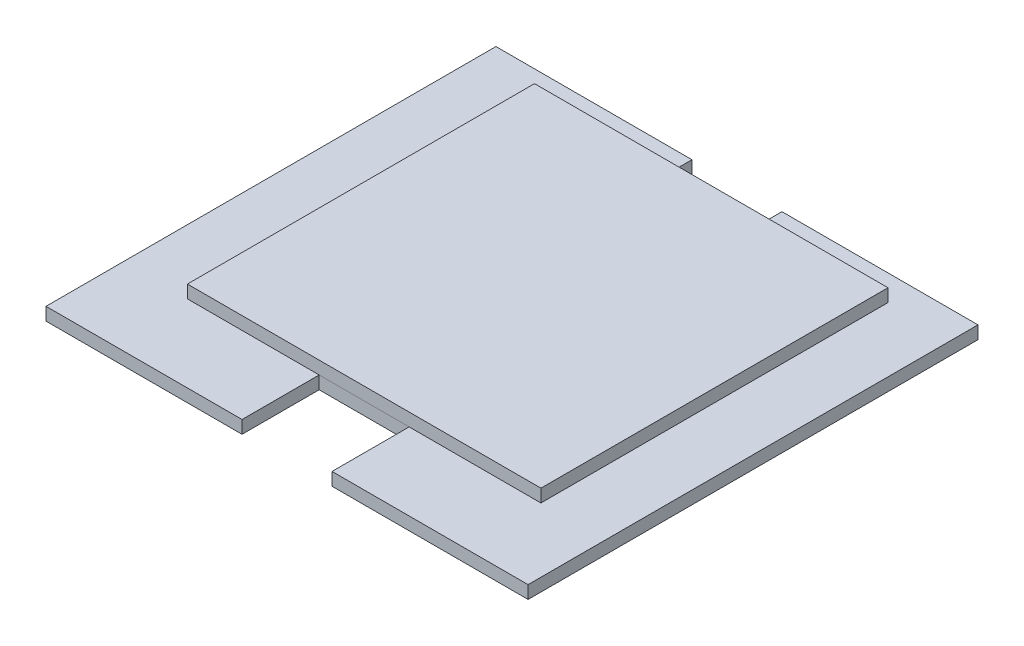
ISO-10303-21;
HEADER;
FILE_DESCRIPTION(('STEP AP214'),'2;1');
FILE_NAME('part.step','',(''),(''),'','','');
FILE_SCHEMA(('AUTOMOTIVE_DESIGN { 1 0 10303 214 1 1 1 1 }'));
ENDSEC;
DATA;
#1=APPLICATION_CONTEXT('core data for automotive mechanical design processes');
#2=APPLICATION_PROTOCOL_DEFINITION('international standard','automotive_design',2000,#1);
#3=PRODUCT_CONTEXT('',#1,'mechanical');
#4=PRODUCT('Part','Part','',(#3));
#5=PRODUCT_RELATED_PRODUCT_CATEGORY('part','',(#4));
#6=PRODUCT_DEFINITION_FORMATION('','',#4);
#7=PRODUCT_DEFINITION_CONTEXT('part definition',#1,'design');
#8=PRODUCT_DEFINITION('design','',#6,#7);
#9=PRODUCT_DEFINITION_SHAPE('','',#8);
#10=(LENGTH_UNIT() NAMED_UNIT(*) SI_UNIT(.MILLI.,.METRE.));
#11=(NAMED_UNIT(*) PLANE_ANGLE_UNIT() SI_UNIT($,.RADIAN.));
#12=(NAMED_UNIT(*) SI_UNIT($,.STERADIAN.) SOLID_ANGLE_UNIT());
#13=UNCERTAINTY_MEASURE_WITH_UNIT(LENGTH_MEASURE(1.E-05),#10,'distance_accuracy_value','');
#14=(GEOMETRIC_REPRESENTATION_CONTEXT(3) GLOBAL_UNCERTAINTY_ASSIGNED_CONTEXT((#13)) GLOBAL_UNIT_ASSIGNED_CONTEXT((#10,
#11,#12)) REPRESENTATION_CONTEXT('',''));
#15=CARTESIAN_POINT('',(0.,0.,0.));
#16=DIRECTION('',(0.,0.,1.));
#17=DIRECTION('',(1.,0.,0.));
#18=AXIS2_PLACEMENT_3D('',#15,#16,#17);
#19=CARTESIAN_POINT('',(-27.5,4.,23.));
#20=DIRECTION('',(1.,0.,0.));
#21=DIRECTION('',(0.,0.,-1.));
#22=AXIS2_PLACEMENT_3D('',#19,#20,#21);
#23=PLANE('',#22);
#24=DIRECTION('',(0.,0.,1.));
#25=VECTOR('',#24,1.);
#26=CARTESIAN_POINT('',(-27.5,2.,23.));
#27=LINE('',#26,#25);
#28=CARTESIAN_POINT('',(-27.5,2.,-31.));
#29=VERTEX_POINT('',#28);
#30=CARTESIAN_POINT('',(-27.5,2.,23.));
#31=VERTEX_POINT('',#30);
#32=EDGE_CURVE('E112',#29,#31,#27,.T.);
#33=ORIENTED_EDGE('',*,*,#32,.T.);
#34=DIRECTION('',(0.,-1.,0.));
#35=VECTOR('',#34,1.);
#36=CARTESIAN_POINT('',(-27.5,4.,23.));
#37=LINE('',#36,#35);
#38=CARTESIAN_POINT('',(-27.5,4.,23.));
#39=VERTEX_POINT('',#38);
#40=EDGE_CURVE('E12',#39,#31,#37,.T.);
#41=ORIENTED_EDGE('',*,*,#40,.F.);
#42=DIRECTION('',(0.,0.,1.));
#43=VECTOR('',#42,1.);
#44=CARTESIAN_POINT('',(-27.5,4.,23.));
#45=LINE('',#44,#43);
#46=CARTESIAN_POINT('',(-27.5,4.,-31.));
#47=VERTEX_POINT('',#46);
#48=EDGE_CURVE('E100',#47,#39,#45,.T.);
#49=ORIENTED_EDGE('',*,*,#48,.F.);
#50=DIRECTION('',(0.,-1.,0.));
#51=VECTOR('',#50,1.);
#52=CARTESIAN_POINT('',(-27.5,4.,-31.));
#53=LINE('',#52,#51);
#54=EDGE_CURVE('E108',#47,#29,#53,.T.);
#55=ORIENTED_EDGE('',*,*,#54,.T.);
#56=EDGE_LOOP('',(#33,#41,#49,#55));
#57=FACE_BOUND('',#56,.T.);
#58=ADVANCED_FACE('F49',(#57),#23,.F.);
#59=CARTESIAN_POINT('',(-27.5,4.,23.));
#60=DIRECTION('',(0.,0.,-1.));
#61=DIRECTION('',(-1.,0.,0.));
#62=AXIS2_PLACEMENT_3D('',#59,#60,#61);
#63=PLANE('',#62);
#64=DIRECTION('',(1.,0.,0.));
#65=VECTOR('',#64,1.);
#66=CARTESIAN_POINT('',(-27.5,2.,23.));
#67=LINE('',#66,#65);
#68=CARTESIAN_POINT('',(27.5,2.,23.));
#69=VERTEX_POINT('',#68);
#70=EDGE_CURVE('E104',#31,#69,#67,.T.);
#71=ORIENTED_EDGE('',*,*,#70,.T.);
#72=DIRECTION('',(0.,-1.,0.));
#73=VECTOR('',#72,1.);
#74=CARTESIAN_POINT('',(27.5,4.,23.));
#75=LINE('',#74,#73);
#76=CARTESIAN_POINT('',(27.5,4.,23.));
#77=VERTEX_POINT('',#76);
#78=EDGE_CURVE('E57',#77,#69,#75,.T.);
#79=ORIENTED_EDGE('',*,*,#78,.F.);
#80=DIRECTION('',(1.,0.,0.));
#81=VECTOR('',#80,1.);
#82=CARTESIAN_POINT('',(-27.5,4.,23.));
#83=LINE('',#82,#81);
#84=EDGE_CURVE('E95',#39,#77,#83,.T.);
#85=ORIENTED_EDGE('',*,*,#84,.F.);
#86=ORIENTED_EDGE('',*,*,#40,.T.);
#87=EDGE_LOOP('',(#71,#79,#85,#86));
#88=FACE_BOUND('',#87,.T.);
#89=ADVANCED_FACE('F103',(#88),#63,.F.);
#90=CARTESIAN_POINT('',(27.5,4.,23.));
#91=DIRECTION('',(-1.,0.,0.));
#92=DIRECTION('',(0.,0.,1.));
#93=AXIS2_PLACEMENT_3D('',#90,#91,#92);
#94=PLANE('',#93);
#95=DIRECTION('',(0.,0.,-1.));
#96=VECTOR('',#95,1.);
#97=CARTESIAN_POINT('',(27.5,2.,23.));
#98=LINE('',#97,#96);
#99=CARTESIAN_POINT('',(27.5,2.,-31.));
#100=VERTEX_POINT('',#99);
#101=EDGE_CURVE('E82',#69,#100,#98,.T.);
#102=ORIENTED_EDGE('',*,*,#101,.T.);
#103=DIRECTION('',(0.,-1.,0.));
#104=VECTOR('',#103,1.);
#105=CARTESIAN_POINT('',(27.5,4.,-31.));
#106=LINE('',#105,#104);
#107=CARTESIAN_POINT('',(27.5,4.,-31.));
#108=VERTEX_POINT('',#107);
#109=EDGE_CURVE('E105',#108,#100,#106,.T.);
#110=ORIENTED_EDGE('',*,*,#109,.F.);
#111=DIRECTION('',(0.,0.,-1.));
#112=VECTOR('',#111,1.);
#113=CARTESIAN_POINT('',(27.5,4.,23.));
#114=LINE('',#113,#112);
#115=EDGE_CURVE('E98',#77,#108,#114,.T.);
#116=ORIENTED_EDGE('',*,*,#115,.F.);
#117=ORIENTED_EDGE('',*,*,#78,.T.);
#118=EDGE_LOOP('',(#102,#110,#116,#117));
#119=FACE_BOUND('',#118,.T.);
#120=ADVANCED_FACE('F106',(#119),#94,.F.);
#121=CARTESIAN_POINT('',(-27.5,4.,-31.));
#122=DIRECTION('',(0.,0.,1.));
#123=DIRECTION('',(1.,0.,0.));
#124=AXIS2_PLACEMENT_3D('',#121,#122,#123);
#125=PLANE('',#124);
#126=DIRECTION('',(-1.,0.,0.));
#127=VECTOR('',#126,1.);
#128=CARTESIAN_POINT('',(-27.5,2.,-31.));
#129=LINE('',#128,#127);
#130=EDGE_CURVE('E88',#100,#29,#129,.T.);
#131=ORIENTED_EDGE('',*,*,#130,.T.);
#132=ORIENTED_EDGE('',*,*,#54,.F.);
#133=DIRECTION('',(-1.,0.,0.));
#134=VECTOR('',#133,1.);
#135=CARTESIAN_POINT('',(-27.5,4.,-31.));
#136=LINE('',#135,#134);
#137=EDGE_CURVE('E65',#108,#47,#136,.T.);
#138=ORIENTED_EDGE('',*,*,#137,.F.);
#139=ORIENTED_EDGE('',*,*,#109,.T.);
#140=EDGE_LOOP('',(#131,#132,#138,#139));
#141=FACE_BOUND('',#140,.T.);
#142=ADVANCED_FACE('F119',(#141),#125,.F.);
#143=CARTESIAN_POINT('',(0.,4.,0.));
#144=DIRECTION('',(0.,-1.,0.));
#145=DIRECTION('',(0.,0.,-1.));
#146=AXIS2_PLACEMENT_3D('',#143,#144,#145);
#147=PLANE('',#146);
#148=ORIENTED_EDGE('',*,*,#48,.T.);
#149=ORIENTED_EDGE('',*,*,#84,.T.);
#150=ORIENTED_EDGE('',*,*,#115,.T.);
#151=ORIENTED_EDGE('',*,*,#137,.T.);
#152=EDGE_LOOP('',(#148,#149,#150,#151));
#153=FACE_BOUND('',#152,.T.);
#154=ADVANCED_FACE('F96',(#153),#147,.F.);
#155=CARTESIAN_POINT('',(0.,2.,0.));
#156=DIRECTION('',(0.,-1.,0.));
#157=DIRECTION('',(0.,0.,-1.));
#158=AXIS2_PLACEMENT_3D('',#155,#156,#157);
#159=PLANE('',#158);
#160=ORIENTED_EDGE('',*,*,#32,.F.);
#161=ORIENTED_EDGE('',*,*,#130,.F.);
#162=ORIENTED_EDGE('',*,*,#101,.F.);
#163=ORIENTED_EDGE('',*,*,#70,.F.);
#164=EDGE_LOOP('',(#160,#161,#162,#163));
#165=FACE_BOUND('',#164,.T.);
#166=ADVANCED_FACE('F122',(#165),#159,.T.);
#167=CLOSED_SHELL('',(#58,#89,#120,#142,#154,#166));
#168=MANIFOLD_SOLID_BREP('B2',#167);
#169=CARTESIAN_POINT('',(37.5,2.,35.));
#170=DIRECTION('',(-1.,0.,0.));
#171=DIRECTION('',(0.,0.,1.));
#172=AXIS2_PLACEMENT_3D('',#169,#170,#171);
#173=PLANE('',#172);
#174=DIRECTION('',(0.,0.,-1.));
#175=VECTOR('',#174,1.);
#176=CARTESIAN_POINT('',(37.5,0.,35.));
#177=LINE('',#176,#175);
#178=CARTESIAN_POINT('',(37.5,0.,35.));
#179=VERTEX_POINT('',#178);
#180=CARTESIAN_POINT('',(37.5,0.,-35.));
#181=VERTEX_POINT('',#180);
#182=EDGE_CURVE('E298',#179,#181,#177,.T.);
#183=ORIENTED_EDGE('',*,*,#182,.T.);
#184=DIRECTION('',(0.,-1.,0.));
#185=VECTOR('',#184,1.);
#186=CARTESIAN_POINT('',(37.5,2.,-35.));
#187=LINE('',#186,#185);
#188=CARTESIAN_POINT('',(37.5,2.,-35.));
#189=VERTEX_POINT('',#188);
#190=EDGE_CURVE('E47',#189,#181,#187,.T.);
#191=ORIENTED_EDGE('',*,*,#190,.F.);
#192=DIRECTION('',(0.,0.,-1.));
#193=VECTOR('',#192,1.);
#194=CARTESIAN_POINT('',(37.5,2.,35.));
#195=LINE('',#194,#193);
#196=CARTESIAN_POINT('',(37.5,2.,35.));
#197=VERTEX_POINT('',#196);
#198=EDGE_CURVE('E332',#197,#189,#195,.T.);
#199=ORIENTED_EDGE('',*,*,#198,.F.);
#200=DIRECTION('',(0.,-1.,0.));
#201=VECTOR('',#200,1.);
#202=CARTESIAN_POINT('',(37.5,2.,35.));
#203=LINE('',#202,#201);
#204=EDGE_CURVE('E294',#197,#179,#203,.T.);
#205=ORIENTED_EDGE('',*,*,#204,.T.);
#206=EDGE_LOOP('',(#183,#191,#199,#205));
#207=FACE_BOUND('',#206,.T.);
#208=ADVANCED_FACE('F173',(#207),#173,.F.);
#209=CARTESIAN_POINT('',(6.99999999999999,2.,-35.));
#210=DIRECTION('',(0.,0.,1.));
#211=DIRECTION('',(1.,0.,0.));
#212=AXIS2_PLACEMENT_3D('',#209,#210,#211);
#213=PLANE('',#212);
#214=DIRECTION('',(-1.,0.,0.));
#215=VECTOR('',#214,1.);
#216=CARTESIAN_POINT('',(6.99999999999999,0.,-35.));
#217=LINE('',#216,#215);
#218=CARTESIAN_POINT('',(6.99999999999999,0.,-35.));
#219=VERTEX_POINT('',#218);
#220=EDGE_CURVE('E302',#181,#219,#217,.T.);
#221=ORIENTED_EDGE('',*,*,#220,.T.);
#222=DIRECTION('',(0.,-1.,0.));
#223=VECTOR('',#222,1.);
#224=CARTESIAN_POINT('',(6.99999999999999,2.,-35.));
#225=LINE('',#224,#223);
#226=CARTESIAN_POINT('',(6.99999999999999,2.,-35.));
#227=VERTEX_POINT('',#226);
#228=EDGE_CURVE('E182',#227,#219,#225,.T.);
#229=ORIENTED_EDGE('',*,*,#228,.F.);
#230=DIRECTION('',(-1.,0.,0.));
#231=VECTOR('',#230,1.);
#232=CARTESIAN_POINT('',(6.99999999999999,2.,-35.));
#233=LINE('',#232,#231);
#234=EDGE_CURVE('E245',#189,#227,#233,.T.);
#235=ORIENTED_EDGE('',*,*,#234,.F.);
#236=ORIENTED_EDGE('',*,*,#190,.T.);
#237=EDGE_LOOP('',(#221,#229,#235,#236));
#238=FACE_BOUND('',#237,.T.);
#239=ADVANCED_FACE('F426',(#238),#213,.F.);
#240=CARTESIAN_POINT('',(6.99999999999999,2.,-35.));
#241=DIRECTION('',(1.,0.,0.));
#242=DIRECTION('',(0.,0.,-1.));
#243=AXIS2_PLACEMENT_3D('',#240,#241,#242);
#244=PLANE('',#243);
#245=DIRECTION('',(0.,0.,1.));
#246=VECTOR('',#245,1.);
#247=CARTESIAN_POINT('',(6.99999999999999,0.,-35.));
#248=LINE('',#247,#246);
#249=CARTESIAN_POINT('',(7.00000000000001,0.,-31.));
#250=VERTEX_POINT('',#249);
#251=EDGE_CURVE('E305',#219,#250,#248,.T.);
#252=ORIENTED_EDGE('',*,*,#251,.T.);
#253=DIRECTION('',(0.,-1.,0.));
#254=VECTOR('',#253,1.);
#255=CARTESIAN_POINT('',(7.00000000000001,2.,-31.));
#256=LINE('',#255,#254);
#257=CARTESIAN_POINT('',(7.00000000000001,2.,-31.));
#258=VERTEX_POINT('',#257);
#259=EDGE_CURVE('E359',#258,#250,#256,.T.);
#260=ORIENTED_EDGE('',*,*,#259,.F.);
#261=DIRECTION('',(0.,0.,1.));
#262=VECTOR('',#261,1.);
#263=CARTESIAN_POINT('',(6.99999999999999,2.,-35.));
#264=LINE('',#263,#262);
#265=EDGE_CURVE('E369',#227,#258,#264,.T.);
#266=ORIENTED_EDGE('',*,*,#265,.F.);
#267=ORIENTED_EDGE('',*,*,#228,.T.);
#268=EDGE_LOOP('',(#252,#260,#266,#267));
#269=FACE_BOUND('',#268,.T.);
#270=ADVANCED_FACE('F367',(#269),#244,.F.);
#271=CARTESIAN_POINT('',(-6.99999999999999,2.,-31.));
#272=DIRECTION('',(0.,0.,1.));
#273=DIRECTION('',(1.,0.,0.));
#274=AXIS2_PLACEMENT_3D('',#271,#272,#273);
#275=PLANE('',#274);
#276=DIRECTION('',(-1.,0.,0.));
#277=VECTOR('',#276,1.);
#278=CARTESIAN_POINT('',(-6.99999999999999,0.,-31.));
#279=LINE('',#278,#277);
#280=CARTESIAN_POINT('',(-6.99999999999999,0.,-31.));
#281=VERTEX_POINT('',#280);
#282=EDGE_CURVE('E308',#250,#281,#279,.T.);
#283=ORIENTED_EDGE('',*,*,#282,.T.);
#284=DIRECTION('',(0.,-1.,0.));
#285=VECTOR('',#284,1.);
#286=CARTESIAN_POINT('',(-6.99999999999999,2.,-31.));
#287=LINE('',#286,#285);
#288=CARTESIAN_POINT('',(-6.99999999999999,2.,-31.));
#289=VERTEX_POINT('',#288);
#290=EDGE_CURVE('E355',#289,#281,#287,.T.);
#291=ORIENTED_EDGE('',*,*,#290,.F.);
#292=DIRECTION('',(-1.,0.,0.));
#293=VECTOR('',#292,1.);
#294=CARTESIAN_POINT('',(-6.99999999999999,2.,-31.));
#295=LINE('',#294,#293);
#296=EDGE_CURVE('E388',#258,#289,#295,.T.);
#297=ORIENTED_EDGE('',*,*,#296,.F.);
#298=ORIENTED_EDGE('',*,*,#259,.T.);
#299=EDGE_LOOP('',(#283,#291,#297,#298));
#300=FACE_BOUND('',#299,.T.);
#301=ADVANCED_FACE('F378',(#300),#275,.F.);
#302=CARTESIAN_POINT('',(-7.00000000000001,2.,-35.));
#303=DIRECTION('',(-1.,0.,0.));
#304=DIRECTION('',(0.,0.,1.));
#305=AXIS2_PLACEMENT_3D('',#302,#303,#304);
#306=PLANE('',#305);
#307=DIRECTION('',(0.,0.,-1.));
#308=VECTOR('',#307,1.);
#309=CARTESIAN_POINT('',(-7.00000000000001,0.,-35.));
#310=LINE('',#309,#308);
#311=CARTESIAN_POINT('',(-7.00000000000001,0.,-35.));
#312=VERTEX_POINT('',#311);
#313=EDGE_CURVE('E311',#281,#312,#310,.T.);
#314=ORIENTED_EDGE('',*,*,#313,.T.);
#315=DIRECTION('',(0.,-1.,0.));
#316=VECTOR('',#315,1.);
#317=CARTESIAN_POINT('',(-7.00000000000001,2.,-35.));
#318=LINE('',#317,#316);
#319=CARTESIAN_POINT('',(-7.00000000000001,2.,-35.));
#320=VERTEX_POINT('',#319);
#321=EDGE_CURVE('E351',#320,#312,#318,.T.);
#322=ORIENTED_EDGE('',*,*,#321,.F.);
#323=DIRECTION('',(0.,0.,-1.));
#324=VECTOR('',#323,1.);
#325=CARTESIAN_POINT('',(-7.00000000000001,2.,-35.));
#326=LINE('',#325,#324);
#327=EDGE_CURVE('E384',#289,#320,#326,.T.);
#328=ORIENTED_EDGE('',*,*,#327,.F.);
#329=ORIENTED_EDGE('',*,*,#290,.T.);
#330=EDGE_LOOP('',(#314,#322,#328,#329));
#331=FACE_BOUND('',#330,.T.);
#332=ADVANCED_FACE('F382',(#331),#306,.F.);
#333=CARTESIAN_POINT('',(-37.5,2.,-35.));
#334=DIRECTION('',(0.,0.,1.));
#335=DIRECTION('',(1.,0.,0.));
#336=AXIS2_PLACEMENT_3D('',#333,#334,#335);
#337=PLANE('',#336);
#338=DIRECTION('',(-1.,0.,0.));
#339=VECTOR('',#338,1.);
#340=CARTESIAN_POINT('',(-37.5,0.,-35.));
#341=LINE('',#340,#339);
#342=CARTESIAN_POINT('',(-37.5,0.,-35.));
#343=VERTEX_POINT('',#342);
#344=EDGE_CURVE('E314',#312,#343,#341,.T.);
#345=ORIENTED_EDGE('',*,*,#344,.T.);
#346=DIRECTION('',(0.,-1.,0.));
#347=VECTOR('',#346,1.);
#348=CARTESIAN_POINT('',(-37.5,2.,-35.));
#349=LINE('',#348,#347);
#350=CARTESIAN_POINT('',(-37.5,2.,-35.));
#351=VERTEX_POINT('',#350);
#352=EDGE_CURVE('E347',#351,#343,#349,.T.);
#353=ORIENTED_EDGE('',*,*,#352,.F.);
#354=DIRECTION('',(-1.,0.,0.));
#355=VECTOR('',#354,1.);
#356=CARTESIAN_POINT('',(-37.5,2.,-35.));
#357=LINE('',#356,#355);
#358=EDGE_CURVE('E387',#320,#351,#357,.T.);
#359=ORIENTED_EDGE('',*,*,#358,.F.);
#360=ORIENTED_EDGE('',*,*,#321,.T.);
#361=EDGE_LOOP('',(#345,#353,#359,#360));
#362=FACE_BOUND('',#361,.T.);
#363=ADVANCED_FACE('F439',(#362),#337,.F.);
#364=CARTESIAN_POINT('',(-37.5,2.,35.));
#365=DIRECTION('',(1.,0.,0.));
#366=DIRECTION('',(0.,0.,-1.));
#367=AXIS2_PLACEMENT_3D('',#364,#365,#366);
#368=PLANE('',#367);
#369=DIRECTION('',(0.,0.,1.));
#370=VECTOR('',#369,1.);
#371=CARTESIAN_POINT('',(-37.5,0.,35.));
#372=LINE('',#371,#370);
#373=CARTESIAN_POINT('',(-37.5,0.,35.));
#374=VERTEX_POINT('',#373);
#375=EDGE_CURVE('E317',#343,#374,#372,.T.);
#376=ORIENTED_EDGE('',*,*,#375,.T.);
#377=DIRECTION('',(0.,-1.,0.));
#378=VECTOR('',#377,1.);
#379=CARTESIAN_POINT('',(-37.5,2.,35.));
#380=LINE('',#379,#378);
#381=CARTESIAN_POINT('',(-37.5,2.,35.));
#382=VERTEX_POINT('',#381);
#383=EDGE_CURVE('E343',#382,#374,#380,.T.);
#384=ORIENTED_EDGE('',*,*,#383,.F.);
#385=DIRECTION('',(0.,0.,1.));
#386=VECTOR('',#385,1.);
#387=CARTESIAN_POINT('',(-37.5,2.,35.));
#388=LINE('',#387,#386);
#389=EDGE_CURVE('E392',#351,#382,#388,.T.);
#390=ORIENTED_EDGE('',*,*,#389,.F.);
#391=ORIENTED_EDGE('',*,*,#352,.T.);
#392=EDGE_LOOP('',(#376,#384,#390,#391));
#393=FACE_BOUND('',#392,.T.);
#394=ADVANCED_FACE('F442',(#393),#368,.F.);
#395=CARTESIAN_POINT('',(-37.5,2.,35.));
#396=DIRECTION('',(0.,0.,-1.));
#397=DIRECTION('',(-1.,0.,0.));
#398=AXIS2_PLACEMENT_3D('',#395,#396,#397);
#399=PLANE('',#398);
#400=DIRECTION('',(1.,0.,0.));
#401=VECTOR('',#400,1.);
#402=CARTESIAN_POINT('',(-37.5,0.,35.));
#403=LINE('',#402,#401);
#404=CARTESIAN_POINT('',(-7.,0.,35.));
#405=VERTEX_POINT('',#404);
#406=EDGE_CURVE('E320',#374,#405,#403,.T.);
#407=ORIENTED_EDGE('',*,*,#406,.T.);
#408=DIRECTION('',(0.,-1.,0.));
#409=VECTOR('',#408,1.);
#410=CARTESIAN_POINT('',(-7.,2.,35.));
#411=LINE('',#410,#409);
#412=CARTESIAN_POINT('',(-7.,2.,35.));
#413=VERTEX_POINT('',#412);
#414=EDGE_CURVE('E339',#413,#405,#411,.T.);
#415=ORIENTED_EDGE('',*,*,#414,.F.);
#416=DIRECTION('',(1.,0.,0.));
#417=VECTOR('',#416,1.);
#418=CARTESIAN_POINT('',(-37.5,2.,35.));
#419=LINE('',#418,#417);
#420=EDGE_CURVE('E399',#382,#413,#419,.T.);
#421=ORIENTED_EDGE('',*,*,#420,.F.);
#422=ORIENTED_EDGE('',*,*,#383,.T.);
#423=EDGE_LOOP('',(#407,#415,#421,#422));
#424=FACE_BOUND('',#423,.T.);
#425=ADVANCED_FACE('F407',(#424),#399,.F.);
#426=CARTESIAN_POINT('',(-7.,2.,35.));
#427=DIRECTION('',(-1.,0.,0.));
#428=DIRECTION('',(0.,0.,1.));
#429=AXIS2_PLACEMENT_3D('',#426,#427,#428);
#430=PLANE('',#429);
#431=DIRECTION('',(0.,0.,-1.));
#432=VECTOR('',#431,1.);
#433=CARTESIAN_POINT('',(-7.,0.,35.));
#434=LINE('',#433,#432);
#435=CARTESIAN_POINT('',(-7.,0.,23.));
#436=VERTEX_POINT('',#435);
#437=EDGE_CURVE('E323',#405,#436,#434,.T.);
#438=ORIENTED_EDGE('',*,*,#437,.T.);
#439=DIRECTION('',(0.,-1.,0.));
#440=VECTOR('',#439,1.);
#441=CARTESIAN_POINT('',(-7.,2.,23.));
#442=LINE('',#441,#440);
#443=CARTESIAN_POINT('',(-7.,2.,23.));
#444=VERTEX_POINT('',#443);
#445=EDGE_CURVE('E287',#444,#436,#442,.T.);
#446=ORIENTED_EDGE('',*,*,#445,.F.);
#447=DIRECTION('',(0.,0.,-1.));
#448=VECTOR('',#447,1.);
#449=CARTESIAN_POINT('',(-7.,2.,35.));
#450=LINE('',#449,#448);
#451=EDGE_CURVE('E276',#413,#444,#450,.T.);
#452=ORIENTED_EDGE('',*,*,#451,.F.);
#453=ORIENTED_EDGE('',*,*,#414,.T.);
#454=EDGE_LOOP('',(#438,#446,#452,#453));
#455=FACE_BOUND('',#454,.T.);
#456=ADVANCED_FACE('F411',(#455),#430,.F.);
#457=CARTESIAN_POINT('',(-7.,2.,23.));
#458=DIRECTION('',(0.,0.,-1.));
#459=DIRECTION('',(-1.,0.,0.));
#460=AXIS2_PLACEMENT_3D('',#457,#458,#459);
#461=PLANE('',#460);
#462=DIRECTION('',(1.,0.,0.));
#463=VECTOR('',#462,1.);
#464=CARTESIAN_POINT('',(-7.,0.,23.));
#465=LINE('',#464,#463);
#466=CARTESIAN_POINT('',(7.,0.,23.));
#467=VERTEX_POINT('',#466);
#468=EDGE_CURVE('E285',#436,#467,#465,.T.);
#469=ORIENTED_EDGE('',*,*,#468,.T.);
#470=DIRECTION('',(0.,-1.,0.));
#471=VECTOR('',#470,1.);
#472=CARTESIAN_POINT('',(7.,2.,23.));
#473=LINE('',#472,#471);
#474=CARTESIAN_POINT('',(7.,2.,23.));
#475=VERTEX_POINT('',#474);
#476=EDGE_CURVE('E282',#475,#467,#473,.T.);
#477=ORIENTED_EDGE('',*,*,#476,.F.);
#478=DIRECTION('',(1.,0.,0.));
#479=VECTOR('',#478,1.);
#480=CARTESIAN_POINT('',(-7.,2.,23.));
#481=LINE('',#480,#479);
#482=EDGE_CURVE('E270',#444,#475,#481,.T.);
#483=ORIENTED_EDGE('',*,*,#482,.F.);
#484=ORIENTED_EDGE('',*,*,#445,.T.);
#485=EDGE_LOOP('',(#469,#477,#483,#484));
#486=FACE_BOUND('',#485,.T.);
#487=ADVANCED_FACE('F283',(#486),#461,.F.);
#488=CARTESIAN_POINT('',(7.,2.,35.));
#489=DIRECTION('',(1.,0.,0.));
#490=DIRECTION('',(0.,0.,-1.));
#491=AXIS2_PLACEMENT_3D('',#488,#489,#490);
#492=PLANE('',#491);
#493=DIRECTION('',(0.,0.,1.));
#494=VECTOR('',#493,1.);
#495=CARTESIAN_POINT('',(7.,0.,35.));
#496=LINE('',#495,#494);
#497=CARTESIAN_POINT('',(7.,0.,35.));
#498=VERTEX_POINT('',#497);
#499=EDGE_CURVE('E231',#467,#498,#496,.T.);
#500=ORIENTED_EDGE('',*,*,#499,.T.);
#501=DIRECTION('',(0.,-1.,0.));
#502=VECTOR('',#501,1.);
#503=CARTESIAN_POINT('',(7.,2.,35.));
#504=LINE('',#503,#502);
#505=CARTESIAN_POINT('',(7.,2.,35.));
#506=VERTEX_POINT('',#505);
#507=EDGE_CURVE('E288',#506,#498,#504,.T.);
#508=ORIENTED_EDGE('',*,*,#507,.F.);
#509=DIRECTION('',(0.,0.,1.));
#510=VECTOR('',#509,1.);
#511=CARTESIAN_POINT('',(7.,2.,35.));
#512=LINE('',#511,#510);
#513=EDGE_CURVE('E274',#475,#506,#512,.T.);
#514=ORIENTED_EDGE('',*,*,#513,.F.);
#515=ORIENTED_EDGE('',*,*,#476,.T.);
#516=EDGE_LOOP('',(#500,#508,#514,#515));
#517=FACE_BOUND('',#516,.T.);
#518=ADVANCED_FACE('F290',(#517),#492,.F.);
#519=CARTESIAN_POINT('',(7.,2.,35.));
#520=DIRECTION('',(0.,0.,-1.));
#521=DIRECTION('',(-1.,0.,0.));
#522=AXIS2_PLACEMENT_3D('',#519,#520,#521);
#523=PLANE('',#522);
#524=DIRECTION('',(1.,0.,0.));
#525=VECTOR('',#524,1.);
#526=CARTESIAN_POINT('',(7.,0.,35.));
#527=LINE('',#526,#525);
#528=EDGE_CURVE('E237',#498,#179,#527,.T.);
#529=ORIENTED_EDGE('',*,*,#528,.T.);
#530=ORIENTED_EDGE('',*,*,#204,.F.);
#531=DIRECTION('',(1.,0.,0.));
#532=VECTOR('',#531,1.);
#533=CARTESIAN_POINT('',(7.,2.,35.));
#534=LINE('',#533,#532);
#535=EDGE_CURVE('E190',#506,#197,#534,.T.);
#536=ORIENTED_EDGE('',*,*,#535,.F.);
#537=ORIENTED_EDGE('',*,*,#507,.T.);
#538=EDGE_LOOP('',(#529,#530,#536,#537));
#539=FACE_BOUND('',#538,.T.);
#540=ADVANCED_FACE('F415',(#539),#523,.F.);
#541=CARTESIAN_POINT('',(0.,2.,0.));
#542=DIRECTION('',(0.,-1.,0.));
#543=DIRECTION('',(0.,0.,-1.));
#544=AXIS2_PLACEMENT_3D('',#541,#542,#543);
#545=PLANE('',#544);
#546=ORIENTED_EDGE('',*,*,#198,.T.);
#547=ORIENTED_EDGE('',*,*,#234,.T.);
#548=ORIENTED_EDGE('',*,*,#265,.T.);
#549=ORIENTED_EDGE('',*,*,#296,.T.);
#550=ORIENTED_EDGE('',*,*,#327,.T.);
#551=ORIENTED_EDGE('',*,*,#358,.T.);
#552=ORIENTED_EDGE('',*,*,#389,.T.);
#553=ORIENTED_EDGE('',*,*,#420,.T.);
#554=ORIENTED_EDGE('',*,*,#451,.T.);
#555=ORIENTED_EDGE('',*,*,#482,.T.);
#556=ORIENTED_EDGE('',*,*,#513,.T.);
#557=ORIENTED_EDGE('',*,*,#535,.T.);
#558=EDGE_LOOP('',(#546,#547,#548,#549,#550,#551,#552,#553,#554,#555,#556,#557));
#559=FACE_BOUND('',#558,.T.);
#560=ADVANCED_FACE('F272',(#559),#545,.F.);
#561=CARTESIAN_POINT('',(0.,0.,0.));
#562=DIRECTION('',(0.,-1.,0.));
#563=DIRECTION('',(0.,0.,-1.));
#564=AXIS2_PLACEMENT_3D('',#561,#562,#563);
#565=PLANE('',#564);
#566=ORIENTED_EDGE('',*,*,#182,.F.);
#567=ORIENTED_EDGE('',*,*,#528,.F.);
#568=ORIENTED_EDGE('',*,*,#499,.F.);
#569=ORIENTED_EDGE('',*,*,#468,.F.);
#570=ORIENTED_EDGE('',*,*,#437,.F.);
#571=ORIENTED_EDGE('',*,*,#406,.F.);
#572=ORIENTED_EDGE('',*,*,#375,.F.);
#573=ORIENTED_EDGE('',*,*,#344,.F.);
#574=ORIENTED_EDGE('',*,*,#313,.F.);
#575=ORIENTED_EDGE('',*,*,#282,.F.);
#576=ORIENTED_EDGE('',*,*,#251,.F.);
#577=ORIENTED_EDGE('',*,*,#220,.F.);
#578=EDGE_LOOP('',(#566,#567,#568,#569,#570,#571,#572,#573,#574,#575,#576,#577));
#579=FACE_BOUND('',#578,.T.);
#580=ADVANCED_FACE('F373',(#579),#565,.T.);
#581=CLOSED_SHELL('',(#208,#239,#270,#301,#332,#363,#394,#425,#456,#487,#518,#540,#560,#580));
#582=MANIFOLD_SOLID_BREP('B6',#581);
#583=ADVANCED_BREP_SHAPE_REPRESENTATION('',(#18,#168,#582),#14);
#584=SHAPE_DEFINITION_REPRESENTATION(#9,#583);
ENDSEC;
END-ISO-10303-21;
